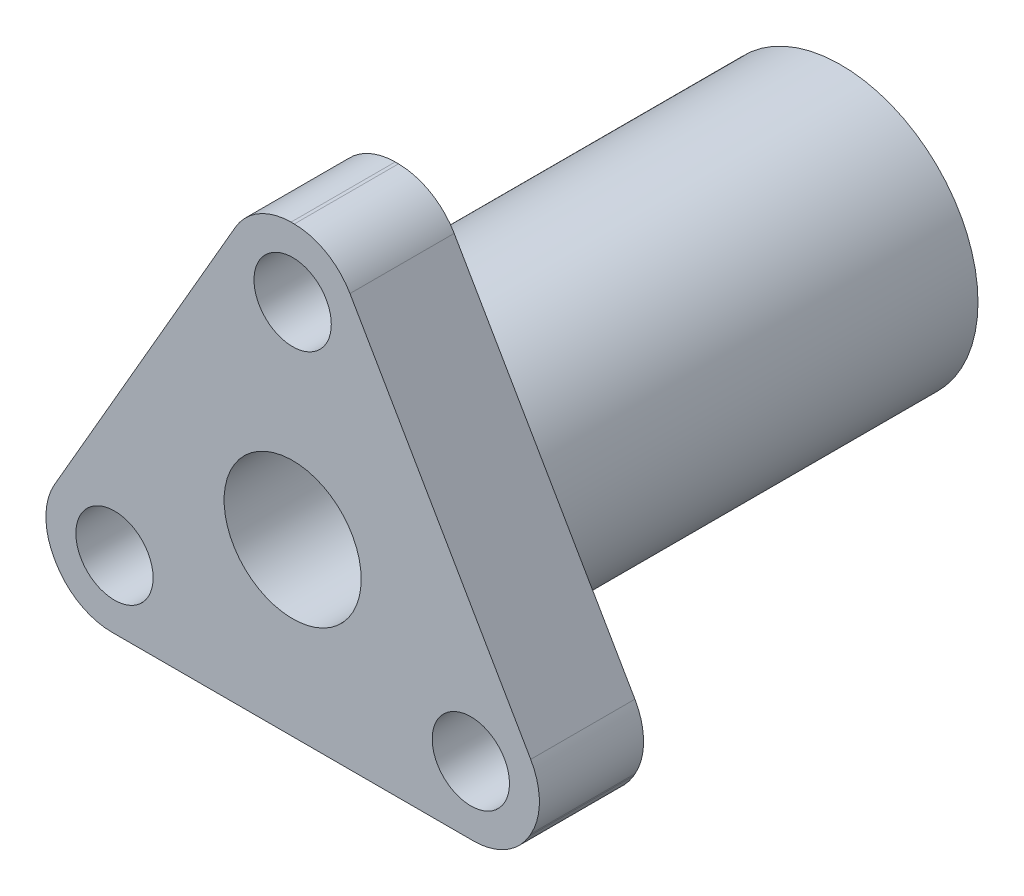
ISO-10303-21;
HEADER;
FILE_DESCRIPTION(('STEP AP214'),'2;1');
FILE_NAME('part.step','',(''),(''),'','','');
FILE_SCHEMA(('AUTOMOTIVE_DESIGN { 1 0 10303 214 1 1 1 1 }'));
ENDSEC;
DATA;
#1=APPLICATION_CONTEXT('core data for automotive mechanical design processes');
#2=APPLICATION_PROTOCOL_DEFINITION('international standard','automotive_design',2000,#1);
#3=PRODUCT_CONTEXT('',#1,'mechanical');
#4=PRODUCT('Part','Part','',(#3));
#5=PRODUCT_RELATED_PRODUCT_CATEGORY('part','',(#4));
#6=PRODUCT_DEFINITION_FORMATION('','',#4);
#7=PRODUCT_DEFINITION_CONTEXT('part definition',#1,'design');
#8=PRODUCT_DEFINITION('design','',#6,#7);
#9=PRODUCT_DEFINITION_SHAPE('','',#8);
#10=(LENGTH_UNIT() NAMED_UNIT(*) SI_UNIT(.MILLI.,.METRE.));
#11=(NAMED_UNIT(*) PLANE_ANGLE_UNIT() SI_UNIT($,.RADIAN.));
#12=(NAMED_UNIT(*) SI_UNIT($,.STERADIAN.) SOLID_ANGLE_UNIT());
#13=UNCERTAINTY_MEASURE_WITH_UNIT(LENGTH_MEASURE(1.E-05),#10,'distance_accuracy_value','');
#14=(GEOMETRIC_REPRESENTATION_CONTEXT(3) GLOBAL_UNCERTAINTY_ASSIGNED_CONTEXT((#13)) GLOBAL_UNIT_ASSIGNED_CONTEXT((#10,
#11,#12)) REPRESENTATION_CONTEXT('',''));
#15=CARTESIAN_POINT('',(0.,0.,0.));
#16=DIRECTION('',(0.,0.,1.));
#17=DIRECTION('',(1.,0.,0.));
#18=AXIS2_PLACEMENT_3D('',#15,#16,#17);
#19=CARTESIAN_POINT('',(-8.429214386,-4.799827584,4.826));
#20=DIRECTION('',(0.,0.,-1.));
#21=DIRECTION('',(-1.,0.,0.));
#22=AXIS2_PLACEMENT_3D('',#19,#20,#21);
#23=CYLINDRICAL_SURFACE('',#22,3.);
#24=CARTESIAN_POINT('',(-8.429214386,-4.799827584,4.826));
#25=DIRECTION('',(0.,0.,-1.));
#26=DIRECTION('',(-1.,0.,0.));
#27=AXIS2_PLACEMENT_3D('',#24,#25,#26);
#28=CIRCLE('',#27,3.);
#29=CARTESIAN_POINT('',(-11.027290598892,-3.29982758195766,4.826));
#30=VERTEX_POINT('',#29);
#31=CARTESIAN_POINT('',(-11.0361879078253,-6.28431034115962,4.826));
#32=VERTEX_POINT('',#31);
#33=EDGE_CURVE('E82',#30,#32,#28,.F.);
#34=ORIENTED_EDGE('',*,*,#33,.F.);
#35=DIRECTION('',(0.,0.,-1.));
#36=VECTOR('',#35,1.);
#37=CARTESIAN_POINT('',(-11.027290597,-3.299827584,2.413));
#38=LINE('',#37,#36);
#39=CARTESIAN_POINT('',(-11.0272905970597,-3.29982758410348,0.));
#40=VERTEX_POINT('',#39);
#41=EDGE_CURVE('E93',#30,#40,#38,.T.);
#42=ORIENTED_EDGE('',*,*,#41,.T.);
#43=CARTESIAN_POINT('',(-8.429214386,-4.799827584,0.));
#44=DIRECTION('',(0.,0.,-1.));
#45=DIRECTION('',(-1.,0.,0.));
#46=AXIS2_PLACEMENT_3D('',#43,#44,#45);
#47=CIRCLE('',#46,3.);
#48=CARTESIAN_POINT('',(-11.0361879078253,-6.28431034115962,0.));
#49=VERTEX_POINT('',#48);
#50=EDGE_CURVE('E21',#49,#40,#47,.T.);
#51=ORIENTED_EDGE('',*,*,#50,.F.);
#52=DIRECTION('',(0.,0.,-1.));
#53=VECTOR('',#52,1.);
#54=CARTESIAN_POINT('',(-11.036187908225,-6.28431034039117,2.413));
#55=LINE('',#54,#53);
#56=EDGE_CURVE('E91',#49,#32,#55,.F.);
#57=ORIENTED_EDGE('',*,*,#56,.T.);
#58=EDGE_LOOP('',(#34,#42,#51,#57));
#59=FACE_BOUND('',#58,.T.);
#60=ADVANCED_FACE('F17',(#59),#23,.T.);
#61=CARTESIAN_POINT('',(0.,0.,4.826));
#62=DIRECTION('',(0.,0.,-1.));
#63=DIRECTION('',(-1.,0.,0.));
#64=AXIS2_PLACEMENT_3D('',#61,#62,#63);
#65=CYLINDRICAL_SURFACE('',#64,12.7);
#66=DIRECTION('',(0.,0.,-1.));
#67=VECTOR('',#66,1.);
#68=CARTESIAN_POINT('',(-10.9604663551056,-6.41546391835776,2.413));
#69=LINE('',#68,#67);
#70=CARTESIAN_POINT('',(-10.9604663552101,-6.41546391782262,0.));
#71=VERTEX_POINT('',#70);
#72=CARTESIAN_POINT('',(-10.9604663552101,-6.41546391782262,4.826));
#73=VERTEX_POINT('',#72);
#74=EDGE_CURVE('E191',#71,#73,#69,.F.);
#75=ORIENTED_EDGE('',*,*,#74,.T.);
#76=CARTESIAN_POINT('',(0.,0.,4.826));
#77=DIRECTION('',(0.,0.,-1.));
#78=DIRECTION('',(-1.,0.,0.));
#79=AXIS2_PLACEMENT_3D('',#76,#77,#78);
#80=CIRCLE('',#79,12.7);
#81=EDGE_CURVE('E103',#32,#73,#80,.F.);
#82=ORIENTED_EDGE('',*,*,#81,.F.);
#83=ORIENTED_EDGE('',*,*,#56,.F.);
#84=CARTESIAN_POINT('',(0.,0.,0.));
#85=DIRECTION('',(0.,0.,-1.));
#86=DIRECTION('',(-1.,0.,0.));
#87=AXIS2_PLACEMENT_3D('',#84,#85,#86);
#88=CIRCLE('',#87,12.7);
#89=EDGE_CURVE('E101',#71,#49,#88,.T.);
#90=ORIENTED_EDGE('',*,*,#89,.F.);
#91=EDGE_LOOP('',(#75,#82,#83,#90));
#92=FACE_BOUND('',#91,.T.);
#93=ADVANCED_FACE('F100',(#92),#65,.T.);
#94=CARTESIAN_POINT('',(0.,0.,4.826));
#95=DIRECTION('',(0.,0.,-1.));
#96=DIRECTION('',(-1.,0.,0.));
#97=AXIS2_PLACEMENT_3D('',#94,#95,#96);
#98=CYLINDRICAL_SURFACE('',#97,12.7);
#99=DIRECTION('',(0.,0.,-1.));
#100=VECTOR('',#99,1.);
#101=CARTESIAN_POINT('',(11.0361879072856,-6.28431034217394,2.413));
#102=LINE('',#101,#100);
#103=CARTESIAN_POINT('',(11.036187907327,-6.28431034203473,0.));
#104=VERTEX_POINT('',#103);
#105=CARTESIAN_POINT('',(11.036187907327,-6.28431034203473,4.826));
#106=VERTEX_POINT('',#105);
#107=EDGE_CURVE('E202',#104,#106,#102,.F.);
#108=ORIENTED_EDGE('',*,*,#107,.T.);
#109=CARTESIAN_POINT('',(0.,0.,4.826));
#110=DIRECTION('',(0.,0.,-1.));
#111=DIRECTION('',(-1.,0.,0.));
#112=AXIS2_PLACEMENT_3D('',#109,#110,#111);
#113=CIRCLE('',#112,12.7);
#114=CARTESIAN_POINT('',(10.960466355793,-6.41546391682663,4.826));
#115=VERTEX_POINT('',#114);
#116=EDGE_CURVE('E111',#115,#106,#113,.F.);
#117=ORIENTED_EDGE('',*,*,#116,.F.);
#118=DIRECTION('',(0.,0.,1.));
#119=VECTOR('',#118,1.);
#120=CARTESIAN_POINT('',(10.9604663562715,-6.41546391636577,2.413));
#121=LINE('',#120,#119);
#122=CARTESIAN_POINT('',(10.960466355793,-6.41546391682663,0.));
#123=VERTEX_POINT('',#122);
#124=EDGE_CURVE('E199',#115,#123,#121,.F.);
#125=ORIENTED_EDGE('',*,*,#124,.T.);
#126=CARTESIAN_POINT('',(0.,0.,0.));
#127=DIRECTION('',(0.,0.,-1.));
#128=DIRECTION('',(-1.,0.,0.));
#129=AXIS2_PLACEMENT_3D('',#126,#127,#128);
#130=CIRCLE('',#129,12.7);
#131=EDGE_CURVE('E113',#104,#123,#130,.T.);
#132=ORIENTED_EDGE('',*,*,#131,.F.);
#133=EDGE_LOOP('',(#108,#117,#125,#132));
#134=FACE_BOUND('',#133,.T.);
#135=ADVANCED_FACE('F230',(#134),#98,.T.);
#136=CARTESIAN_POINT('',(0.,0.,4.826));
#137=DIRECTION('',(0.,0.,-1.));
#138=DIRECTION('',(-1.,0.,0.));
#139=AXIS2_PLACEMENT_3D('',#136,#137,#138);
#140=CYLINDRICAL_SURFACE('',#139,12.7);
#141=DIRECTION('',(0.,0.,-1.));
#142=VECTOR('',#141,1.);
#143=CARTESIAN_POINT('',(-0.0757215504046168,12.6997742595207,2.413));
#144=LINE('',#143,#142);
#145=CARTESIAN_POINT('',(-0.0757215510637508,12.6997742595959,0.));
#146=VERTEX_POINT('',#145);
#147=CARTESIAN_POINT('',(-0.0757215510637508,12.6997742595959,4.826));
#148=VERTEX_POINT('',#147);
#149=EDGE_CURVE('E124',#146,#148,#144,.F.);
#150=ORIENTED_EDGE('',*,*,#149,.T.);
#151=CARTESIAN_POINT('',(0.,0.,4.826));
#152=DIRECTION('',(0.,0.,-1.));
#153=DIRECTION('',(-1.,0.,0.));
#154=AXIS2_PLACEMENT_3D('',#151,#152,#153);
#155=CIRCLE('',#154,12.7);
#156=CARTESIAN_POINT('',(0.0757215516790511,12.6997742595922,4.826));
#157=VERTEX_POINT('',#156);
#158=EDGE_CURVE('E36',#157,#148,#155,.F.);
#159=ORIENTED_EDGE('',*,*,#158,.F.);
#160=DIRECTION('',(0.,0.,1.));
#161=VECTOR('',#160,1.);
#162=CARTESIAN_POINT('',(0.0757215516352175,12.6997742595134,2.413));
#163=LINE('',#162,#161);
#164=CARTESIAN_POINT('',(0.0757215516790511,12.6997742595922,0.));
#165=VERTEX_POINT('',#164);
#166=EDGE_CURVE('E129',#157,#165,#163,.F.);
#167=ORIENTED_EDGE('',*,*,#166,.T.);
#168=CARTESIAN_POINT('',(0.,0.,0.));
#169=DIRECTION('',(0.,0.,-1.));
#170=DIRECTION('',(-1.,0.,0.));
#171=AXIS2_PLACEMENT_3D('',#168,#169,#170);
#172=CIRCLE('',#171,12.7);
#173=EDGE_CURVE('E119',#146,#165,#172,.T.);
#174=ORIENTED_EDGE('',*,*,#173,.F.);
#175=EDGE_LOOP('',(#150,#159,#167,#174));
#176=FACE_BOUND('',#175,.T.);
#177=ADVANCED_FACE('F251',(#176),#140,.T.);
#178=CARTESIAN_POINT('',(6.4262,-6.4262,-20.57));
#179=DIRECTION('',(0.,0.,-1.));
#180=DIRECTION('',(-1.,0.,0.));
#181=AXIS2_PLACEMENT_3D('',#178,#179,#180);
#182=PLANE('',#181);
#183=CARTESIAN_POINT('',(0.,0.,-20.57));
#184=DIRECTION('',(0.,0.,1.));
#185=DIRECTION('',(1.,0.,0.));
#186=AXIS2_PLACEMENT_3D('',#183,#184,#185);
#187=CIRCLE('',#186,3.175);
#188=CARTESIAN_POINT('',(3.175,0.,-20.57));
#189=VERTEX_POINT('',#188);
#190=EDGE_CURVE('E125',#189,#189,#187,.F.);
#191=ORIENTED_EDGE('',*,*,#190,.F.);
#192=EDGE_LOOP('',(#191));
#193=FACE_BOUND('',#192,.T.);
#194=CARTESIAN_POINT('',(0.,0.,-20.57));
#195=DIRECTION('',(0.,0.,1.));
#196=DIRECTION('',(1.,0.,0.));
#197=AXIS2_PLACEMENT_3D('',#194,#195,#196);
#198=CIRCLE('',#197,6.35);
#199=CARTESIAN_POINT('',(6.35,0.,-20.57));
#200=VERTEX_POINT('',#199);
#201=EDGE_CURVE('E121',#200,#200,#198,.F.);
#202=ORIENTED_EDGE('',*,*,#201,.T.);
#203=EDGE_LOOP('',(#202));
#204=FACE_BOUND('',#203,.T.);
#205=ADVANCED_FACE('F355',(#193,#204),#182,.T.);
#206=CARTESIAN_POINT('',(0.,0.,-20.57));
#207=DIRECTION('',(0.,0.,1.));
#208=DIRECTION('',(1.,0.,0.));
#209=AXIS2_PLACEMENT_3D('',#206,#207,#208);
#210=CYLINDRICAL_SURFACE('',#209,6.35);
#211=ORIENTED_EDGE('',*,*,#201,.F.);
#212=EDGE_LOOP('',(#211));
#213=FACE_BOUND('',#212,.T.);
#214=CARTESIAN_POINT('',(0.,0.,0.));
#215=DIRECTION('',(0.,0.,1.));
#216=DIRECTION('',(1.,0.,0.));
#217=AXIS2_PLACEMENT_3D('',#214,#215,#216);
#218=CIRCLE('',#217,6.35);
#219=CARTESIAN_POINT('',(6.35,0.,0.));
#220=VERTEX_POINT('',#219);
#221=EDGE_CURVE('E154',#220,#220,#218,.F.);
#222=ORIENTED_EDGE('',*,*,#221,.T.);
#223=EDGE_LOOP('',(#222));
#224=FACE_BOUND('',#223,.T.);
#225=ADVANCED_FACE('F358',(#213,#224),#210,.T.);
#226=CARTESIAN_POINT('',(-0.057834571,9.699827584,4.826));
#227=DIRECTION('',(0.,0.,-1.));
#228=DIRECTION('',(-1.,0.,0.));
#229=AXIS2_PLACEMENT_3D('',#226,#227,#228);
#230=CYLINDRICAL_SURFACE('',#229,3.);
#231=DIRECTION('',(0.,0.,1.));
#232=VECTOR('',#231,1.);
#233=CARTESIAN_POINT('',(-2.655910783,11.199827584,2.413));
#234=LINE('',#233,#232);
#235=CARTESIAN_POINT('',(-2.65591078293474,11.199827584113,0.));
#236=VERTEX_POINT('',#235);
#237=CARTESIAN_POINT('',(-2.65591078021305,11.1998275836296,4.826));
#238=VERTEX_POINT('',#237);
#239=EDGE_CURVE('E189',#236,#238,#234,.T.);
#240=ORIENTED_EDGE('',*,*,#239,.T.);
#241=CARTESIAN_POINT('',(-0.057834571,9.699827584,4.826));
#242=DIRECTION('',(0.,0.,-1.));
#243=DIRECTION('',(-1.,0.,0.));
#244=AXIS2_PLACEMENT_3D('',#241,#242,#243);
#245=CIRCLE('',#244,3.);
#246=EDGE_CURVE('E157',#148,#238,#245,.F.);
#247=ORIENTED_EDGE('',*,*,#246,.F.);
#248=ORIENTED_EDGE('',*,*,#149,.F.);
#249=CARTESIAN_POINT('',(-0.057834571,9.699827584,0.));
#250=DIRECTION('',(0.,0.,-1.));
#251=DIRECTION('',(-1.,0.,0.));
#252=AXIS2_PLACEMENT_3D('',#249,#250,#251);
#253=CIRCLE('',#252,3.);
#254=EDGE_CURVE('E145',#146,#236,#253,.F.);
#255=ORIENTED_EDGE('',*,*,#254,.T.);
#256=EDGE_LOOP('',(#240,#247,#248,#255));
#257=FACE_BOUND('',#256,.T.);
#258=ADVANCED_FACE('F254',(#257),#230,.T.);
#259=CARTESIAN_POINT('',(-11.027290597,-3.299827584,0.));
#260=DIRECTION('',(0.866025403794824,-0.499999999982012,0.));
#261=DIRECTION('',(0.499999999982012,0.866025403794824,0.));
#262=AXIS2_PLACEMENT_3D('',#259,#260,#261);
#263=PLANE('',#262);
#264=ORIENTED_EDGE('',*,*,#41,.F.);
#265=DIRECTION('',(-0.500000000526,-0.866025403480752,0.));
#266=VECTOR('',#265,1.);
#267=CARTESIAN_POINT('',(-2.65591077695895,11.1998275840684,4.826));
#268=LINE('',#267,#266);
#269=EDGE_CURVE('E160',#238,#30,#268,.T.);
#270=ORIENTED_EDGE('',*,*,#269,.F.);
#271=ORIENTED_EDGE('',*,*,#239,.F.);
#272=DIRECTION('',(0.499999999982012,0.866025403794824,0.));
#273=VECTOR('',#272,1.);
#274=CARTESIAN_POINT('',(-11.027290597,-3.299827584,0.));
#275=LINE('',#274,#273);
#276=EDGE_CURVE('E128',#236,#40,#275,.F.);
#277=ORIENTED_EDGE('',*,*,#276,.T.);
#278=EDGE_LOOP('',(#264,#270,#271,#277));
#279=FACE_BOUND('',#278,.T.);
#280=ADVANCED_FACE('F258',(#279),#263,.F.);
#281=CARTESIAN_POINT('',(-8.371379815,-4.9,4.826));
#282=DIRECTION('',(0.,0.,-1.));
#283=DIRECTION('',(-1.,0.,0.));
#284=AXIS2_PLACEMENT_3D('',#281,#282,#283);
#285=CYLINDRICAL_SURFACE('',#284,3.);
#286=DIRECTION('',(0.,0.,1.));
#287=VECTOR('',#286,1.);
#288=CARTESIAN_POINT('',(-8.371379815,-7.9,2.413));
#289=LINE('',#288,#287);
#290=CARTESIAN_POINT('',(-8.371379815,-7.9,0.));
#291=VERTEX_POINT('',#290);
#292=CARTESIAN_POINT('',(-8.371379815,-7.9,4.826));
#293=VERTEX_POINT('',#292);
#294=EDGE_CURVE('E195',#291,#293,#289,.T.);
#295=ORIENTED_EDGE('',*,*,#294,.T.);
#296=CARTESIAN_POINT('',(-8.371379815,-4.9,4.826));
#297=DIRECTION('',(0.,0.,-1.));
#298=DIRECTION('',(-1.,0.,0.));
#299=AXIS2_PLACEMENT_3D('',#296,#297,#298);
#300=CIRCLE('',#299,3.);
#301=EDGE_CURVE('E162',#73,#293,#300,.F.);
#302=ORIENTED_EDGE('',*,*,#301,.F.);
#303=ORIENTED_EDGE('',*,*,#74,.F.);
#304=CARTESIAN_POINT('',(-8.371379815,-4.9,0.));
#305=DIRECTION('',(0.,0.,-1.));
#306=DIRECTION('',(-1.,0.,0.));
#307=AXIS2_PLACEMENT_3D('',#304,#305,#306);
#308=CIRCLE('',#307,3.);
#309=EDGE_CURVE('E110',#71,#291,#308,.F.);
#310=ORIENTED_EDGE('',*,*,#309,.T.);
#311=EDGE_LOOP('',(#295,#302,#303,#310));
#312=FACE_BOUND('',#311,.T.);
#313=ADVANCED_FACE('F265',(#312),#285,.T.);
#314=CARTESIAN_POINT('',(-8.371379815,-7.9,0.));
#315=DIRECTION('',(0.,1.,0.));
#316=DIRECTION('',(0.,0.,1.));
#317=AXIS2_PLACEMENT_3D('',#314,#315,#316);
#318=PLANE('',#317);
#319=DIRECTION('',(0.,0.,-1.));
#320=VECTOR('',#319,1.);
#321=CARTESIAN_POINT('',(8.37137981615407,-7.9,2.413));
#322=LINE('',#321,#320);
#323=CARTESIAN_POINT('',(8.37137981557703,-7.9,0.));
#324=VERTEX_POINT('',#323);
#325=CARTESIAN_POINT('',(8.37137981557703,-7.9,4.826));
#326=VERTEX_POINT('',#325);
#327=EDGE_CURVE('E198',#324,#326,#322,.F.);
#328=ORIENTED_EDGE('',*,*,#327,.T.);
#329=DIRECTION('',(1.,0.,0.));
#330=VECTOR('',#329,1.);
#331=CARTESIAN_POINT('',(0.,-7.9,4.826));
#332=LINE('',#331,#330);
#333=EDGE_CURVE('E165',#293,#326,#332,.T.);
#334=ORIENTED_EDGE('',*,*,#333,.F.);
#335=ORIENTED_EDGE('',*,*,#294,.F.);
#336=DIRECTION('',(1.,0.,0.));
#337=VECTOR('',#336,1.);
#338=CARTESIAN_POINT('',(0.,-7.9,0.));
#339=LINE('',#338,#337);
#340=EDGE_CURVE('E132',#291,#324,#339,.T.);
#341=ORIENTED_EDGE('',*,*,#340,.T.);
#342=EDGE_LOOP('',(#328,#334,#335,#341));
#343=FACE_BOUND('',#342,.T.);
#344=ADVANCED_FACE('F224',(#343),#318,.F.);
#345=CARTESIAN_POINT('',(8.371379815,-4.9,4.826));
#346=DIRECTION('',(0.,0.,-1.));
#347=DIRECTION('',(-1.,0.,0.));
#348=AXIS2_PLACEMENT_3D('',#345,#346,#347);
#349=CYLINDRICAL_SURFACE('',#348,3.);
#350=ORIENTED_EDGE('',*,*,#124,.F.);
#351=CARTESIAN_POINT('',(8.371379815,-4.9,4.826));
#352=DIRECTION('',(0.,0.,-1.));
#353=DIRECTION('',(-1.,0.,0.));
#354=AXIS2_PLACEMENT_3D('',#351,#352,#353);
#355=CIRCLE('',#354,3.);
#356=EDGE_CURVE('E166',#326,#115,#355,.F.);
#357=ORIENTED_EDGE('',*,*,#356,.F.);
#358=ORIENTED_EDGE('',*,*,#327,.F.);
#359=CARTESIAN_POINT('',(8.371379815,-4.9,0.));
#360=DIRECTION('',(0.,0.,-1.));
#361=DIRECTION('',(-1.,0.,0.));
#362=AXIS2_PLACEMENT_3D('',#359,#360,#361);
#363=CIRCLE('',#362,3.);
#364=EDGE_CURVE('E133',#324,#123,#363,.F.);
#365=ORIENTED_EDGE('',*,*,#364,.T.);
#366=EDGE_LOOP('',(#350,#357,#358,#365));
#367=FACE_BOUND('',#366,.T.);
#368=ADVANCED_FACE('F228',(#367),#349,.T.);
#369=CARTESIAN_POINT('',(8.429214386,-4.799827584,4.826));
#370=DIRECTION('',(0.,0.,-1.));
#371=DIRECTION('',(-1.,0.,0.));
#372=AXIS2_PLACEMENT_3D('',#369,#370,#371);
#373=CYLINDRICAL_SURFACE('',#372,3.);
#374=DIRECTION('',(0.,0.,1.));
#375=VECTOR('',#374,1.);
#376=CARTESIAN_POINT('',(11.027290597,-3.299827584,2.413));
#377=LINE('',#376,#375);
#378=CARTESIAN_POINT('',(11.0272905970597,-3.29982758410348,0.));
#379=VERTEX_POINT('',#378);
#380=CARTESIAN_POINT('',(11.027290598892,-3.29982758195766,4.826));
#381=VERTEX_POINT('',#380);
#382=EDGE_CURVE('E207',#379,#381,#377,.T.);
#383=ORIENTED_EDGE('',*,*,#382,.T.);
#384=CARTESIAN_POINT('',(8.429214386,-4.799827584,4.826));
#385=DIRECTION('',(0.,0.,-1.));
#386=DIRECTION('',(-1.,0.,0.));
#387=AXIS2_PLACEMENT_3D('',#384,#385,#386);
#388=CIRCLE('',#387,3.);
#389=EDGE_CURVE('E169',#106,#381,#388,.F.);
#390=ORIENTED_EDGE('',*,*,#389,.F.);
#391=ORIENTED_EDGE('',*,*,#107,.F.);
#392=CARTESIAN_POINT('',(8.429214386,-4.799827584,0.));
#393=DIRECTION('',(0.,0.,-1.));
#394=DIRECTION('',(-1.,0.,0.));
#395=AXIS2_PLACEMENT_3D('',#392,#393,#394);
#396=CIRCLE('',#395,3.);
#397=EDGE_CURVE('E136',#104,#379,#396,.F.);
#398=ORIENTED_EDGE('',*,*,#397,.T.);
#399=EDGE_LOOP('',(#383,#390,#391,#398));
#400=FACE_BOUND('',#399,.T.);
#401=ADVANCED_FACE('F237',(#400),#373,.T.);
#402=CARTESIAN_POINT('',(2.655910783,11.199827584,0.));
#403=DIRECTION('',(-0.866025403794824,-0.499999999982012,0.));
#404=DIRECTION('',(0.499999999982012,-0.866025403794824,0.));
#405=AXIS2_PLACEMENT_3D('',#402,#403,#404);
#406=PLANE('',#405);
#407=DIRECTION('',(0.,0.,-1.));
#408=VECTOR('',#407,1.);
#409=CARTESIAN_POINT('',(2.65591078236607,11.1998275839779,2.413));
#410=LINE('',#409,#408);
#411=CARTESIAN_POINT('',(2.65591078261778,11.199827584102,0.));
#412=VERTEX_POINT('',#411);
#413=CARTESIAN_POINT('',(2.65591077989609,11.1998275836186,4.826));
#414=VERTEX_POINT('',#413);
#415=EDGE_CURVE('E210',#412,#414,#410,.F.);
#416=ORIENTED_EDGE('',*,*,#415,.T.);
#417=DIRECTION('',(-0.500000000526,0.866025403480753,0.));
#418=VECTOR('',#417,1.);
#419=CARTESIAN_POINT('',(11.0272905998897,-3.2998275783664,4.826));
#420=LINE('',#419,#418);
#421=EDGE_CURVE('E172',#381,#414,#420,.T.);
#422=ORIENTED_EDGE('',*,*,#421,.F.);
#423=ORIENTED_EDGE('',*,*,#382,.F.);
#424=DIRECTION('',(0.499999999982012,-0.866025403794824,0.));
#425=VECTOR('',#424,1.);
#426=CARTESIAN_POINT('',(2.655910783,11.199827584,0.));
#427=LINE('',#426,#425);
#428=EDGE_CURVE('E139',#379,#412,#427,.F.);
#429=ORIENTED_EDGE('',*,*,#428,.T.);
#430=EDGE_LOOP('',(#416,#422,#423,#429));
#431=FACE_BOUND('',#430,.T.);
#432=ADVANCED_FACE('F241',(#431),#406,.F.);
#433=CARTESIAN_POINT('',(0.057834571,9.699827584,4.826));
#434=DIRECTION('',(0.,0.,-1.));
#435=DIRECTION('',(-1.,0.,0.));
#436=AXIS2_PLACEMENT_3D('',#433,#434,#435);
#437=CYLINDRICAL_SURFACE('',#436,3.);
#438=ORIENTED_EDGE('',*,*,#166,.F.);
#439=CARTESIAN_POINT('',(0.057834571,9.699827584,4.826));
#440=DIRECTION('',(0.,0.,-1.));
#441=DIRECTION('',(-1.,0.,0.));
#442=AXIS2_PLACEMENT_3D('',#439,#440,#441);
#443=CIRCLE('',#442,3.);
#444=EDGE_CURVE('E174',#414,#157,#443,.F.);
#445=ORIENTED_EDGE('',*,*,#444,.F.);
#446=ORIENTED_EDGE('',*,*,#415,.F.);
#447=CARTESIAN_POINT('',(0.057834571,9.699827584,0.));
#448=DIRECTION('',(0.,0.,-1.));
#449=DIRECTION('',(-1.,0.,0.));
#450=AXIS2_PLACEMENT_3D('',#447,#448,#449);
#451=CIRCLE('',#450,3.);
#452=EDGE_CURVE('E142',#412,#165,#451,.F.);
#453=ORIENTED_EDGE('',*,*,#452,.T.);
#454=EDGE_LOOP('',(#438,#445,#446,#453));
#455=FACE_BOUND('',#454,.T.);
#456=ADVANCED_FACE('F247',(#455),#437,.T.);
#457=CARTESIAN_POINT('',(-8.253222098,-4.765,0.));
#458=DIRECTION('',(0.,0.,1.));
#459=DIRECTION('',(1.,0.,0.));
#460=AXIS2_PLACEMENT_3D('',#457,#458,#459);
#461=CYLINDRICAL_SURFACE('',#460,1.79);
#462=CARTESIAN_POINT('',(-8.253222098,-4.765,4.826));
#463=DIRECTION('',(0.,0.,1.));
#464=DIRECTION('',(1.,0.,0.));
#465=AXIS2_PLACEMENT_3D('',#462,#463,#464);
#466=CIRCLE('',#465,1.79);
#467=CARTESIAN_POINT('',(-6.463222098,-4.765,4.826));
#468=VERTEX_POINT('',#467);
#469=EDGE_CURVE('E177',#468,#468,#466,.F.);
#470=ORIENTED_EDGE('',*,*,#469,.F.);
#471=EDGE_LOOP('',(#470));
#472=FACE_BOUND('',#471,.T.);
#473=CARTESIAN_POINT('',(-8.253222098,-4.765,0.));
#474=DIRECTION('',(0.,0.,1.));
#475=DIRECTION('',(1.,0.,0.));
#476=AXIS2_PLACEMENT_3D('',#473,#474,#475);
#477=CIRCLE('',#476,1.79);
#478=CARTESIAN_POINT('',(-6.463222098,-4.765,0.));
#479=VERTEX_POINT('',#478);
#480=EDGE_CURVE('E148',#479,#479,#477,.F.);
#481=ORIENTED_EDGE('',*,*,#480,.T.);
#482=EDGE_LOOP('',(#481));
#483=FACE_BOUND('',#482,.T.);
#484=ADVANCED_FACE('F294',(#472,#483),#461,.F.);
#485=CARTESIAN_POINT('',(0.,9.53,0.));
#486=DIRECTION('',(0.,0.,1.));
#487=DIRECTION('',(1.,0.,0.));
#488=AXIS2_PLACEMENT_3D('',#485,#486,#487);
#489=CYLINDRICAL_SURFACE('',#488,1.79);
#490=CARTESIAN_POINT('',(0.,9.53,4.826));
#491=DIRECTION('',(0.,0.,1.));
#492=DIRECTION('',(1.,0.,0.));
#493=AXIS2_PLACEMENT_3D('',#490,#491,#492);
#494=CIRCLE('',#493,1.79);
#495=CARTESIAN_POINT('',(1.79,9.53,4.826));
#496=VERTEX_POINT('',#495);
#497=EDGE_CURVE('E180',#496,#496,#494,.F.);
#498=ORIENTED_EDGE('',*,*,#497,.F.);
#499=EDGE_LOOP('',(#498));
#500=FACE_BOUND('',#499,.T.);
#501=CARTESIAN_POINT('',(0.,9.53,0.));
#502=DIRECTION('',(0.,0.,1.));
#503=DIRECTION('',(1.,0.,0.));
#504=AXIS2_PLACEMENT_3D('',#501,#502,#503);
#505=CIRCLE('',#504,1.79);
#506=CARTESIAN_POINT('',(1.79,9.53,0.));
#507=VERTEX_POINT('',#506);
#508=EDGE_CURVE('E151',#507,#507,#505,.F.);
#509=ORIENTED_EDGE('',*,*,#508,.T.);
#510=EDGE_LOOP('',(#509));
#511=FACE_BOUND('',#510,.T.);
#512=ADVANCED_FACE('F290',(#500,#511),#489,.F.);
#513=CARTESIAN_POINT('',(0.,0.,-20.57));
#514=DIRECTION('',(0.,0.,1.));
#515=DIRECTION('',(1.,0.,0.));
#516=AXIS2_PLACEMENT_3D('',#513,#514,#515);
#517=CYLINDRICAL_SURFACE('',#516,3.175);
#518=CARTESIAN_POINT('',(0.,0.,4.826));
#519=DIRECTION('',(0.,0.,1.));
#520=DIRECTION('',(1.,0.,0.));
#521=AXIS2_PLACEMENT_3D('',#518,#519,#520);
#522=CIRCLE('',#521,3.175);
#523=CARTESIAN_POINT('',(3.175,0.,4.826));
#524=VERTEX_POINT('',#523);
#525=EDGE_CURVE('E183',#524,#524,#522,.F.);
#526=ORIENTED_EDGE('',*,*,#525,.F.);
#527=EDGE_LOOP('',(#526));
#528=FACE_BOUND('',#527,.T.);
#529=ORIENTED_EDGE('',*,*,#190,.T.);
#530=EDGE_LOOP('',(#529));
#531=FACE_BOUND('',#530,.T.);
#532=ADVANCED_FACE('F287',(#528,#531),#517,.F.);
#533=CARTESIAN_POINT('',(-11.566364958,-7.9,0.));
#534=DIRECTION('',(0.,0.,1.));
#535=DIRECTION('',(1.,0.,0.));
#536=AXIS2_PLACEMENT_3D('',#533,#534,#535);
#537=PLANE('',#536);
#538=ORIENTED_EDGE('',*,*,#221,.F.);
#539=EDGE_LOOP('',(#538));
#540=FACE_BOUND('',#539,.T.);
#541=ORIENTED_EDGE('',*,*,#508,.F.);
#542=EDGE_LOOP('',(#541));
#543=FACE_BOUND('',#542,.T.);
#544=ORIENTED_EDGE('',*,*,#480,.F.);
#545=EDGE_LOOP('',(#544));
#546=FACE_BOUND('',#545,.T.);
#547=CARTESIAN_POINT('',(8.253222098,-4.765,0.));
#548=DIRECTION('',(0.,0.,1.));
#549=DIRECTION('',(1.,0.,0.));
#550=AXIS2_PLACEMENT_3D('',#547,#548,#549);
#551=CIRCLE('',#550,1.79);
#552=CARTESIAN_POINT('',(10.043222098,-4.765,0.));
#553=VERTEX_POINT('',#552);
#554=EDGE_CURVE('E27',#553,#553,#551,.F.);
#555=ORIENTED_EDGE('',*,*,#554,.F.);
#556=EDGE_LOOP('',(#555));
#557=FACE_BOUND('',#556,.T.);
#558=ORIENTED_EDGE('',*,*,#173,.T.);
#559=ORIENTED_EDGE('',*,*,#452,.F.);
#560=ORIENTED_EDGE('',*,*,#428,.F.);
#561=ORIENTED_EDGE('',*,*,#397,.F.);
#562=ORIENTED_EDGE('',*,*,#131,.T.);
#563=ORIENTED_EDGE('',*,*,#364,.F.);
#564=ORIENTED_EDGE('',*,*,#340,.F.);
#565=ORIENTED_EDGE('',*,*,#309,.F.);
#566=ORIENTED_EDGE('',*,*,#89,.T.);
#567=ORIENTED_EDGE('',*,*,#50,.T.);
#568=ORIENTED_EDGE('',*,*,#276,.F.);
#569=ORIENTED_EDGE('',*,*,#254,.F.);
#570=EDGE_LOOP('',(#558,#559,#560,#561,#562,#563,#564,#565,#566,#567,#568,#569));
#571=FACE_BOUND('',#570,.T.);
#572=ADVANCED_FACE('F107',(#540,#543,#546,#557,#571),#537,.F.);
#573=CARTESIAN_POINT('',(-11.566364958,-7.9,4.826));
#574=DIRECTION('',(0.,0.,1.));
#575=DIRECTION('',(1.,0.,0.));
#576=AXIS2_PLACEMENT_3D('',#573,#574,#575);
#577=PLANE('',#576);
#578=ORIENTED_EDGE('',*,*,#525,.T.);
#579=EDGE_LOOP('',(#578));
#580=FACE_BOUND('',#579,.T.);
#581=ORIENTED_EDGE('',*,*,#497,.T.);
#582=EDGE_LOOP('',(#581));
#583=FACE_BOUND('',#582,.T.);
#584=ORIENTED_EDGE('',*,*,#469,.T.);
#585=EDGE_LOOP('',(#584));
#586=FACE_BOUND('',#585,.T.);
#587=CARTESIAN_POINT('',(8.253222098,-4.765,4.826));
#588=DIRECTION('',(0.,0.,1.));
#589=DIRECTION('',(1.,0.,0.));
#590=AXIS2_PLACEMENT_3D('',#587,#588,#589);
#591=CIRCLE('',#590,1.79);
#592=CARTESIAN_POINT('',(10.043222098,-4.765,4.826));
#593=VERTEX_POINT('',#592);
#594=EDGE_CURVE('E11',#593,#593,#591,.T.);
#595=ORIENTED_EDGE('',*,*,#594,.F.);
#596=EDGE_LOOP('',(#595));
#597=FACE_BOUND('',#596,.T.);
#598=ORIENTED_EDGE('',*,*,#444,.T.);
#599=ORIENTED_EDGE('',*,*,#158,.T.);
#600=ORIENTED_EDGE('',*,*,#246,.T.);
#601=ORIENTED_EDGE('',*,*,#269,.T.);
#602=ORIENTED_EDGE('',*,*,#33,.T.);
#603=ORIENTED_EDGE('',*,*,#81,.T.);
#604=ORIENTED_EDGE('',*,*,#301,.T.);
#605=ORIENTED_EDGE('',*,*,#333,.T.);
#606=ORIENTED_EDGE('',*,*,#356,.T.);
#607=ORIENTED_EDGE('',*,*,#116,.T.);
#608=ORIENTED_EDGE('',*,*,#389,.T.);
#609=ORIENTED_EDGE('',*,*,#421,.T.);
#610=EDGE_LOOP('',(#598,#599,#600,#601,#602,#603,#604,#605,#606,#607,#608,#609));
#611=FACE_BOUND('',#610,.T.);
#612=ADVANCED_FACE('F19',(#580,#583,#586,#597,#611),#577,.T.);
#613=CARTESIAN_POINT('',(8.253222098,-4.765,0.));
#614=DIRECTION('',(0.,0.,1.));
#615=DIRECTION('',(1.,0.,0.));
#616=AXIS2_PLACEMENT_3D('',#613,#614,#615);
#617=CYLINDRICAL_SURFACE('',#616,1.79);
#618=ORIENTED_EDGE('',*,*,#594,.T.);
#619=EDGE_LOOP('',(#618));
#620=FACE_BOUND('',#619,.T.);
#621=ORIENTED_EDGE('',*,*,#554,.T.);
#622=EDGE_LOOP('',(#621));
#623=FACE_BOUND('',#622,.T.);
#624=ADVANCED_FACE('F277',(#620,#623),#617,.F.);
#625=CLOSED_SHELL('',(#60,#93,#135,#177,#205,#225,#258,#280,#313,#344,#368,#401,#432,#456,#484,
#512,#532,#572,#612,#624));
#626=MANIFOLD_SOLID_BREP('B1',#625);
#627=ADVANCED_BREP_SHAPE_REPRESENTATION('',(#18,#626),#14);
#628=SHAPE_DEFINITION_REPRESENTATION(#9,#627);
ENDSEC;
END-ISO-10303-21;
